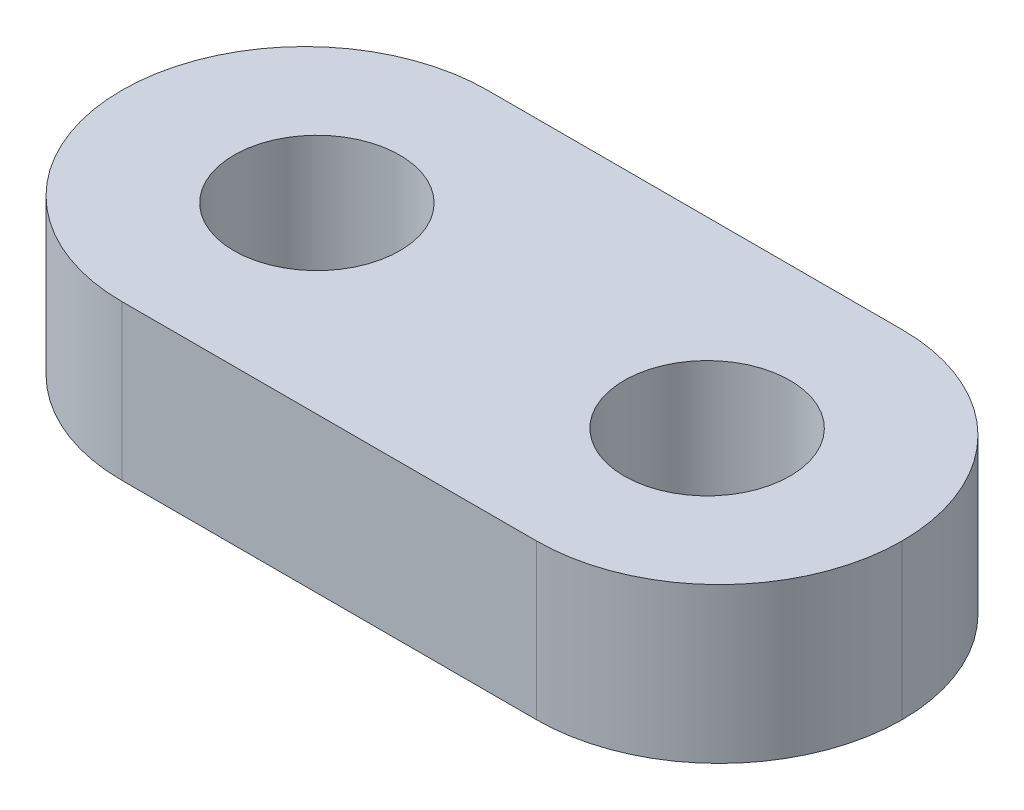
ISO-10303-21;
HEADER;
FILE_DESCRIPTION(('STEP AP214'),'2;1');
FILE_NAME('part.step','',(''),(''),'','','');
FILE_SCHEMA(('AUTOMOTIVE_DESIGN { 1 0 10303 214 1 1 1 1 }'));
ENDSEC;
DATA;
#1=APPLICATION_CONTEXT('core data for automotive mechanical design processes');
#2=APPLICATION_PROTOCOL_DEFINITION('international standard','automotive_design',2000,#1);
#3=PRODUCT_CONTEXT('',#1,'mechanical');
#4=PRODUCT('Part','Part','',(#3));
#5=PRODUCT_RELATED_PRODUCT_CATEGORY('part','',(#4));
#6=PRODUCT_DEFINITION_FORMATION('','',#4);
#7=PRODUCT_DEFINITION_CONTEXT('part definition',#1,'design');
#8=PRODUCT_DEFINITION('design','',#6,#7);
#9=PRODUCT_DEFINITION_SHAPE('','',#8);
#10=(LENGTH_UNIT() NAMED_UNIT(*) SI_UNIT(.MILLI.,.METRE.));
#11=(NAMED_UNIT(*) PLANE_ANGLE_UNIT() SI_UNIT($,.RADIAN.));
#12=(NAMED_UNIT(*) SI_UNIT($,.STERADIAN.) SOLID_ANGLE_UNIT());
#13=UNCERTAINTY_MEASURE_WITH_UNIT(LENGTH_MEASURE(1.E-05),#10,'distance_accuracy_value','');
#14=(GEOMETRIC_REPRESENTATION_CONTEXT(3) GLOBAL_UNCERTAINTY_ASSIGNED_CONTEXT((#13)) GLOBAL_UNIT_ASSIGNED_CONTEXT((#10,
#11,#12)) REPRESENTATION_CONTEXT('',''));
#15=CARTESIAN_POINT('',(0.,0.,0.));
#16=DIRECTION('',(0.,0.,1.));
#17=DIRECTION('',(1.,0.,0.));
#18=AXIS2_PLACEMENT_3D('',#15,#16,#17);
#19=CARTESIAN_POINT('',(0.,6.35,0.));
#20=DIRECTION('',(0.,0.,-1.));
#21=DIRECTION('',(-1.,0.,0.));
#22=AXIS2_PLACEMENT_3D('',#19,#20,#21);
#23=PLANE('',#22);
#24=DIRECTION('',(1.,0.,0.));
#25=VECTOR('',#24,1.);
#26=CARTESIAN_POINT('',(0.,0.,0.));
#27=LINE('',#26,#25);
#28=CARTESIAN_POINT('',(7.5,0.,0.));
#29=VERTEX_POINT('',#28);
#30=CARTESIAN_POINT('',(24.5,0.,0.));
#31=VERTEX_POINT('',#30);
#32=EDGE_CURVE('E97',#29,#31,#27,.T.);
#33=ORIENTED_EDGE('',*,*,#32,.T.);
#34=DIRECTION('',(0.,-1.,0.));
#35=VECTOR('',#34,1.);
#36=CARTESIAN_POINT('',(24.5,6.35,0.));
#37=LINE('',#36,#35);
#38=CARTESIAN_POINT('',(24.5,6.35,0.));
#39=VERTEX_POINT('',#38);
#40=EDGE_CURVE('E115',#31,#39,#37,.F.);
#41=ORIENTED_EDGE('',*,*,#40,.T.);
#42=DIRECTION('',(1.,0.,0.));
#43=VECTOR('',#42,1.);
#44=CARTESIAN_POINT('',(0.,6.35,0.));
#45=LINE('',#44,#43);
#46=CARTESIAN_POINT('',(7.5,6.35,0.));
#47=VERTEX_POINT('',#46);
#48=EDGE_CURVE('E142',#47,#39,#45,.T.);
#49=ORIENTED_EDGE('',*,*,#48,.F.);
#50=DIRECTION('',(0.,-1.,0.));
#51=VECTOR('',#50,1.);
#52=CARTESIAN_POINT('',(7.5,6.35,0.));
#53=LINE('',#52,#51);
#54=EDGE_CURVE('E113',#47,#29,#53,.T.);
#55=ORIENTED_EDGE('',*,*,#54,.T.);
#56=EDGE_LOOP('',(#33,#41,#49,#55));
#57=FACE_BOUND('',#56,.T.);
#58=ADVANCED_FACE('F33',(#57),#23,.F.);
#59=CARTESIAN_POINT('',(0.,6.35,-15.));
#60=DIRECTION('',(0.,0.,1.));
#61=DIRECTION('',(1.,0.,0.));
#62=AXIS2_PLACEMENT_3D('',#59,#60,#61);
#63=PLANE('',#62);
#64=DIRECTION('',(-1.,0.,0.));
#65=VECTOR('',#64,1.);
#66=CARTESIAN_POINT('',(0.,6.35,-15.));
#67=LINE('',#66,#65);
#68=CARTESIAN_POINT('',(24.5,6.35,-15.));
#69=VERTEX_POINT('',#68);
#70=CARTESIAN_POINT('',(7.5,6.35,-15.));
#71=VERTEX_POINT('',#70);
#72=EDGE_CURVE('E100',#69,#71,#67,.T.);
#73=ORIENTED_EDGE('',*,*,#72,.F.);
#74=DIRECTION('',(0.,-1.,0.));
#75=VECTOR('',#74,1.);
#76=CARTESIAN_POINT('',(24.5,6.35,-15.));
#77=LINE('',#76,#75);
#78=CARTESIAN_POINT('',(24.5,0.,-15.));
#79=VERTEX_POINT('',#78);
#80=EDGE_CURVE('E11',#69,#79,#77,.T.);
#81=ORIENTED_EDGE('',*,*,#80,.T.);
#82=DIRECTION('',(-1.,0.,0.));
#83=VECTOR('',#82,1.);
#84=CARTESIAN_POINT('',(0.,0.,-15.));
#85=LINE('',#84,#83);
#86=CARTESIAN_POINT('',(7.5,0.,-15.));
#87=VERTEX_POINT('',#86);
#88=EDGE_CURVE('E145',#79,#87,#85,.T.);
#89=ORIENTED_EDGE('',*,*,#88,.T.);
#90=DIRECTION('',(0.,-1.,0.));
#91=VECTOR('',#90,1.);
#92=CARTESIAN_POINT('',(7.5,6.35,-15.));
#93=LINE('',#92,#91);
#94=EDGE_CURVE('E42',#87,#71,#93,.F.);
#95=ORIENTED_EDGE('',*,*,#94,.T.);
#96=EDGE_LOOP('',(#73,#81,#89,#95));
#97=FACE_BOUND('',#96,.T.);
#98=ADVANCED_FACE('F148',(#97),#63,.F.);
#99=CARTESIAN_POINT('',(0.,6.35,0.));
#100=DIRECTION('',(0.,-1.,0.));
#101=DIRECTION('',(0.,0.,-1.));
#102=AXIS2_PLACEMENT_3D('',#99,#100,#101);
#103=PLANE('',#102);
#104=CARTESIAN_POINT('',(8.,6.35,-7.5));
#105=DIRECTION('',(0.,1.,0.));
#106=DIRECTION('',(0.,0.,1.));
#107=AXIS2_PLACEMENT_3D('',#104,#105,#106);
#108=CIRCLE('',#107,3.4);
#109=CARTESIAN_POINT('',(8.,6.35,-4.1));
#110=VERTEX_POINT('',#109);
#111=EDGE_CURVE('E124',#110,#110,#108,.T.);
#112=ORIENTED_EDGE('',*,*,#111,.F.);
#113=EDGE_LOOP('',(#112));
#114=FACE_BOUND('',#113,.T.);
#115=CARTESIAN_POINT('',(24.,6.35,-7.5));
#116=DIRECTION('',(0.,1.,0.));
#117=DIRECTION('',(0.,0.,1.));
#118=AXIS2_PLACEMENT_3D('',#115,#116,#117);
#119=CIRCLE('',#118,3.4);
#120=CARTESIAN_POINT('',(24.,6.35,-4.1));
#121=VERTEX_POINT('',#120);
#122=EDGE_CURVE('E134',#121,#121,#119,.T.);
#123=ORIENTED_EDGE('',*,*,#122,.F.);
#124=EDGE_LOOP('',(#123));
#125=FACE_BOUND('',#124,.T.);
#126=ORIENTED_EDGE('',*,*,#48,.T.);
#127=CARTESIAN_POINT('',(24.5,6.35,-7.5));
#128=DIRECTION('',(0.,-1.,0.));
#129=DIRECTION('',(0.,0.,-1.));
#130=AXIS2_PLACEMENT_3D('',#127,#128,#129);
#131=CIRCLE('',#130,7.5);
#132=CARTESIAN_POINT('',(32.,6.35,-7.5));
#133=VERTEX_POINT('',#132);
#134=EDGE_CURVE('E121',#39,#133,#131,.F.);
#135=ORIENTED_EDGE('',*,*,#134,.T.);
#136=CARTESIAN_POINT('',(24.5,6.35,-7.5));
#137=DIRECTION('',(0.,-1.,0.));
#138=DIRECTION('',(0.,0.,-1.));
#139=AXIS2_PLACEMENT_3D('',#136,#137,#138);
#140=CIRCLE('',#139,7.5);
#141=EDGE_CURVE('E58',#133,#69,#140,.F.);
#142=ORIENTED_EDGE('',*,*,#141,.T.);
#143=ORIENTED_EDGE('',*,*,#72,.T.);
#144=CARTESIAN_POINT('',(7.5,6.35,-7.5));
#145=DIRECTION('',(0.,-1.,0.));
#146=DIRECTION('',(0.,0.,-1.));
#147=AXIS2_PLACEMENT_3D('',#144,#145,#146);
#148=CIRCLE('',#147,7.5);
#149=CARTESIAN_POINT('',(0.,6.35,-7.5));
#150=VERTEX_POINT('',#149);
#151=EDGE_CURVE('E50',#71,#150,#148,.F.);
#152=ORIENTED_EDGE('',*,*,#151,.T.);
#153=CARTESIAN_POINT('',(7.5,6.35,-7.5));
#154=DIRECTION('',(0.,-1.,0.));
#155=DIRECTION('',(0.,0.,-1.));
#156=AXIS2_PLACEMENT_3D('',#153,#154,#155);
#157=CIRCLE('',#156,7.5);
#158=EDGE_CURVE('E103',#150,#47,#157,.F.);
#159=ORIENTED_EDGE('',*,*,#158,.T.);
#160=EDGE_LOOP('',(#126,#135,#142,#143,#152,#159));
#161=FACE_BOUND('',#160,.T.);
#162=ADVANCED_FACE('F157',(#114,#125,#161),#103,.F.);
#163=CARTESIAN_POINT('',(0.,0.,0.));
#164=DIRECTION('',(0.,-1.,0.));
#165=DIRECTION('',(0.,0.,-1.));
#166=AXIS2_PLACEMENT_3D('',#163,#164,#165);
#167=PLANE('',#166);
#168=CARTESIAN_POINT('',(8.,0.,-7.5));
#169=DIRECTION('',(0.,1.,0.));
#170=DIRECTION('',(0.,0.,1.));
#171=AXIS2_PLACEMENT_3D('',#168,#169,#170);
#172=CIRCLE('',#171,3.4);
#173=CARTESIAN_POINT('',(8.,0.,-4.1));
#174=VERTEX_POINT('',#173);
#175=EDGE_CURVE('E129',#174,#174,#172,.T.);
#176=ORIENTED_EDGE('',*,*,#175,.T.);
#177=EDGE_LOOP('',(#176));
#178=FACE_BOUND('',#177,.T.);
#179=CARTESIAN_POINT('',(24.,0.,-7.5));
#180=DIRECTION('',(0.,1.,0.));
#181=DIRECTION('',(0.,0.,1.));
#182=AXIS2_PLACEMENT_3D('',#179,#180,#181);
#183=CIRCLE('',#182,3.4);
#184=CARTESIAN_POINT('',(24.,0.,-4.1));
#185=VERTEX_POINT('',#184);
#186=EDGE_CURVE('E139',#185,#185,#183,.T.);
#187=ORIENTED_EDGE('',*,*,#186,.T.);
#188=EDGE_LOOP('',(#187));
#189=FACE_BOUND('',#188,.T.);
#190=CARTESIAN_POINT('',(24.5,0.,-7.5));
#191=DIRECTION('',(0.,-1.,0.));
#192=DIRECTION('',(0.,0.,-1.));
#193=AXIS2_PLACEMENT_3D('',#190,#191,#192);
#194=CIRCLE('',#193,7.5);
#195=CARTESIAN_POINT('',(32.,0.,-7.5));
#196=VERTEX_POINT('',#195);
#197=EDGE_CURVE('E106',#79,#196,#194,.T.);
#198=ORIENTED_EDGE('',*,*,#197,.T.);
#199=CARTESIAN_POINT('',(24.5,0.,-7.5));
#200=DIRECTION('',(0.,-1.,0.));
#201=DIRECTION('',(0.,0.,-1.));
#202=AXIS2_PLACEMENT_3D('',#199,#200,#201);
#203=CIRCLE('',#202,7.5);
#204=EDGE_CURVE('E108',#196,#31,#203,.T.);
#205=ORIENTED_EDGE('',*,*,#204,.T.);
#206=ORIENTED_EDGE('',*,*,#32,.F.);
#207=CARTESIAN_POINT('',(7.5,0.,-7.5));
#208=DIRECTION('',(0.,-1.,0.));
#209=DIRECTION('',(0.,0.,-1.));
#210=AXIS2_PLACEMENT_3D('',#207,#208,#209);
#211=CIRCLE('',#210,7.5);
#212=CARTESIAN_POINT('',(0.,0.,-7.5));
#213=VERTEX_POINT('',#212);
#214=EDGE_CURVE('E89',#29,#213,#211,.T.);
#215=ORIENTED_EDGE('',*,*,#214,.T.);
#216=CARTESIAN_POINT('',(7.5,0.,-7.5));
#217=DIRECTION('',(0.,-1.,0.));
#218=DIRECTION('',(0.,0.,-1.));
#219=AXIS2_PLACEMENT_3D('',#216,#217,#218);
#220=CIRCLE('',#219,7.5);
#221=EDGE_CURVE('E94',#213,#87,#220,.T.);
#222=ORIENTED_EDGE('',*,*,#221,.T.);
#223=ORIENTED_EDGE('',*,*,#88,.F.);
#224=EDGE_LOOP('',(#198,#205,#206,#215,#222,#223));
#225=FACE_BOUND('',#224,.T.);
#226=ADVANCED_FACE('F91',(#178,#189,#225),#167,.T.);
#227=CARTESIAN_POINT('',(24.,6.35,-7.5));
#228=DIRECTION('',(0.,1.,0.));
#229=DIRECTION('',(0.,0.,1.));
#230=AXIS2_PLACEMENT_3D('',#227,#228,#229);
#231=CYLINDRICAL_SURFACE('',#230,3.4);
#232=ORIENTED_EDGE('',*,*,#186,.F.);
#233=EDGE_LOOP('',(#232));
#234=FACE_BOUND('',#233,.T.);
#235=ORIENTED_EDGE('',*,*,#122,.T.);
#236=EDGE_LOOP('',(#235));
#237=FACE_BOUND('',#236,.T.);
#238=ADVANCED_FACE('F165',(#234,#237),#231,.F.);
#239=CARTESIAN_POINT('',(8.,6.35,-7.5));
#240=DIRECTION('',(0.,1.,0.));
#241=DIRECTION('',(0.,0.,1.));
#242=AXIS2_PLACEMENT_3D('',#239,#240,#241);
#243=CYLINDRICAL_SURFACE('',#242,3.4);
#244=ORIENTED_EDGE('',*,*,#175,.F.);
#245=EDGE_LOOP('',(#244));
#246=FACE_BOUND('',#245,.T.);
#247=ORIENTED_EDGE('',*,*,#111,.T.);
#248=EDGE_LOOP('',(#247));
#249=FACE_BOUND('',#248,.T.);
#250=ADVANCED_FACE('F179',(#246,#249),#243,.F.);
#251=CARTESIAN_POINT('',(24.5,6.35,-7.5));
#252=DIRECTION('',(0.,-1.,0.));
#253=DIRECTION('',(0.,0.,-1.));
#254=AXIS2_PLACEMENT_3D('',#251,#252,#253);
#255=CYLINDRICAL_SURFACE('',#254,7.5);
#256=ORIENTED_EDGE('',*,*,#80,.F.);
#257=ORIENTED_EDGE('',*,*,#141,.F.);
#258=DIRECTION('',(0.,-1.,0.));
#259=VECTOR('',#258,1.);
#260=CARTESIAN_POINT('',(32.,6.35,-7.5));
#261=LINE('',#260,#259);
#262=EDGE_CURVE('E104',#196,#133,#261,.F.);
#263=ORIENTED_EDGE('',*,*,#262,.F.);
#264=ORIENTED_EDGE('',*,*,#197,.F.);
#265=EDGE_LOOP('',(#256,#257,#263,#264));
#266=FACE_BOUND('',#265,.T.);
#267=ADVANCED_FACE('F152',(#266),#255,.T.);
#268=CARTESIAN_POINT('',(24.5,6.35,-7.5));
#269=DIRECTION('',(0.,-1.,0.));
#270=DIRECTION('',(0.,0.,-1.));
#271=AXIS2_PLACEMENT_3D('',#268,#269,#270);
#272=CYLINDRICAL_SURFACE('',#271,7.5);
#273=ORIENTED_EDGE('',*,*,#134,.F.);
#274=ORIENTED_EDGE('',*,*,#40,.F.);
#275=ORIENTED_EDGE('',*,*,#204,.F.);
#276=ORIENTED_EDGE('',*,*,#262,.T.);
#277=EDGE_LOOP('',(#273,#274,#275,#276));
#278=FACE_BOUND('',#277,.T.);
#279=ADVANCED_FACE('F154',(#278),#272,.T.);
#280=CARTESIAN_POINT('',(7.5,6.35,-7.5));
#281=DIRECTION('',(0.,-1.,0.));
#282=DIRECTION('',(0.,0.,-1.));
#283=AXIS2_PLACEMENT_3D('',#280,#281,#282);
#284=CYLINDRICAL_SURFACE('',#283,7.5);
#285=ORIENTED_EDGE('',*,*,#54,.F.);
#286=ORIENTED_EDGE('',*,*,#158,.F.);
#287=DIRECTION('',(0.,-1.,0.));
#288=VECTOR('',#287,1.);
#289=CARTESIAN_POINT('',(0.,6.35,-7.5));
#290=LINE('',#289,#288);
#291=EDGE_CURVE('E37',#213,#150,#290,.F.);
#292=ORIENTED_EDGE('',*,*,#291,.F.);
#293=ORIENTED_EDGE('',*,*,#214,.F.);
#294=EDGE_LOOP('',(#285,#286,#292,#293));
#295=FACE_BOUND('',#294,.T.);
#296=ADVANCED_FACE('F35',(#295),#284,.T.);
#297=CARTESIAN_POINT('',(7.5,6.35,-7.5));
#298=DIRECTION('',(0.,-1.,0.));
#299=DIRECTION('',(0.,0.,-1.));
#300=AXIS2_PLACEMENT_3D('',#297,#298,#299);
#301=CYLINDRICAL_SURFACE('',#300,7.5);
#302=ORIENTED_EDGE('',*,*,#151,.F.);
#303=ORIENTED_EDGE('',*,*,#94,.F.);
#304=ORIENTED_EDGE('',*,*,#221,.F.);
#305=ORIENTED_EDGE('',*,*,#291,.T.);
#306=EDGE_LOOP('',(#302,#303,#304,#305));
#307=FACE_BOUND('',#306,.T.);
#308=ADVANCED_FACE('F105',(#307),#301,.T.);
#309=CLOSED_SHELL('',(#58,#98,#162,#226,#238,#250,#267,#279,#296,#308));
#310=MANIFOLD_SOLID_BREP('B2',#309);
#311=ADVANCED_BREP_SHAPE_REPRESENTATION('',(#18,#310),#14);
#312=SHAPE_DEFINITION_REPRESENTATION(#9,#311);
ENDSEC;
END-ISO-10303-21;
